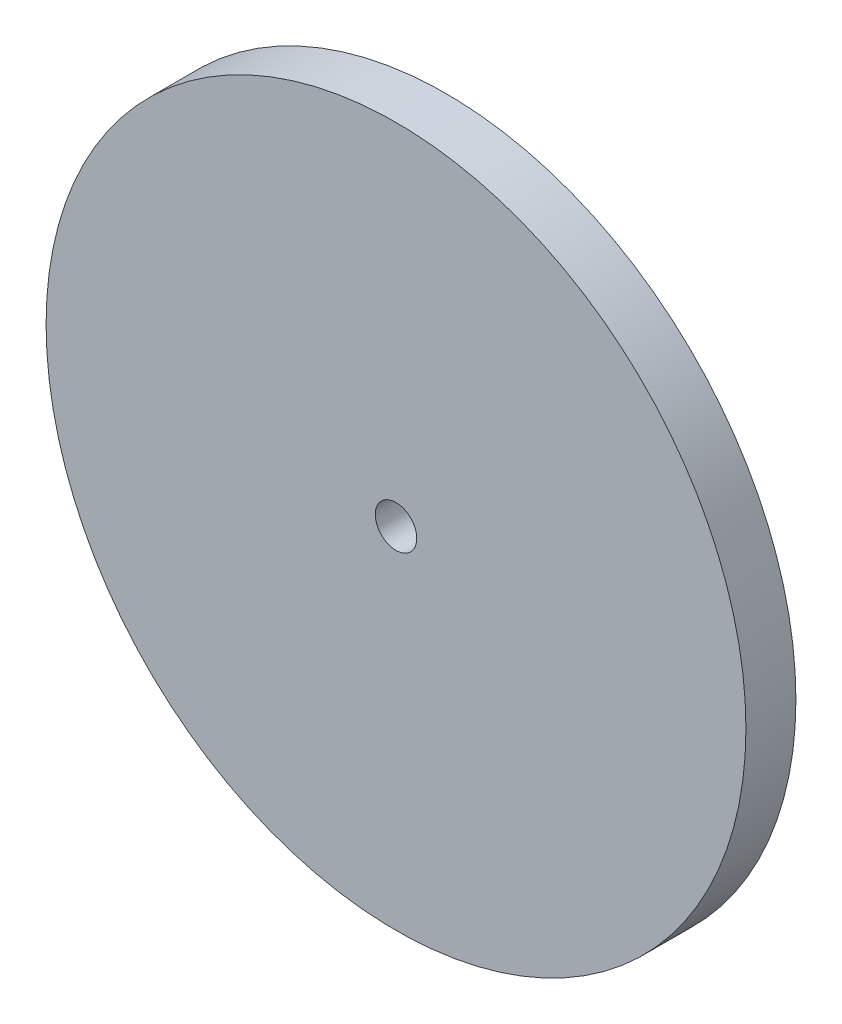
ISO-10303-21;
HEADER;
FILE_DESCRIPTION(('STEP AP214'),'2;1');
FILE_NAME('part.step','',(''),(''),'','','');
FILE_SCHEMA(('AUTOMOTIVE_DESIGN { 1 0 10303 214 1 1 1 1 }'));
ENDSEC;
DATA;
#1=APPLICATION_CONTEXT('core data for automotive mechanical design processes');
#2=APPLICATION_PROTOCOL_DEFINITION('international standard','automotive_design',2000,#1);
#3=PRODUCT_CONTEXT('',#1,'mechanical');
#4=PRODUCT('Part','Part','',(#3));
#5=PRODUCT_RELATED_PRODUCT_CATEGORY('part','',(#4));
#6=PRODUCT_DEFINITION_FORMATION('','',#4);
#7=PRODUCT_DEFINITION_CONTEXT('part definition',#1,'design');
#8=PRODUCT_DEFINITION('design','',#6,#7);
#9=PRODUCT_DEFINITION_SHAPE('','',#8);
#10=(LENGTH_UNIT() NAMED_UNIT(*) SI_UNIT(.MILLI.,.METRE.));
#11=(NAMED_UNIT(*) PLANE_ANGLE_UNIT() SI_UNIT($,.RADIAN.));
#12=(NAMED_UNIT(*) SI_UNIT($,.STERADIAN.) SOLID_ANGLE_UNIT());
#13=UNCERTAINTY_MEASURE_WITH_UNIT(LENGTH_MEASURE(1.E-05),#10,'distance_accuracy_value','');
#14=(GEOMETRIC_REPRESENTATION_CONTEXT(3) GLOBAL_UNCERTAINTY_ASSIGNED_CONTEXT((#13)) GLOBAL_UNIT_ASSIGNED_CONTEXT((#10,
#11,#12)) REPRESENTATION_CONTEXT('',''));
#15=CARTESIAN_POINT('',(0.,0.,0.));
#16=DIRECTION('',(0.,0.,1.));
#17=DIRECTION('',(1.,0.,0.));
#18=AXIS2_PLACEMENT_3D('',#15,#16,#17);
#19=CARTESIAN_POINT('',(0.,0.,5.));
#20=DIRECTION('',(0.,0.,-1.));
#21=DIRECTION('',(-1.,0.,0.));
#22=AXIS2_PLACEMENT_3D('',#19,#20,#21);
#23=CYLINDRICAL_SURFACE('',#22,35.);
#24=CARTESIAN_POINT('',(0.,0.,5.));
#25=DIRECTION('',(0.,0.,1.));
#26=DIRECTION('',(1.,0.,0.));
#27=AXIS2_PLACEMENT_3D('',#24,#25,#26);
#28=CIRCLE('',#27,35.);
#29=CARTESIAN_POINT('',(35.,0.,5.));
#30=VERTEX_POINT('',#29);
#31=EDGE_CURVE('E10',#30,#30,#28,.T.);
#32=ORIENTED_EDGE('',*,*,#31,.F.);
#33=EDGE_LOOP('',(#32));
#34=FACE_BOUND('',#33,.T.);
#35=CARTESIAN_POINT('',(0.,0.,0.));
#36=DIRECTION('',(0.,0.,1.));
#37=DIRECTION('',(1.,0.,0.));
#38=AXIS2_PLACEMENT_3D('',#35,#36,#37);
#39=CIRCLE('',#38,35.);
#40=CARTESIAN_POINT('',(35.,0.,0.));
#41=VERTEX_POINT('',#40);
#42=EDGE_CURVE('E40',#41,#41,#39,.T.);
#43=ORIENTED_EDGE('',*,*,#42,.T.);
#44=EDGE_LOOP('',(#43));
#45=FACE_BOUND('',#44,.T.);
#46=ADVANCED_FACE('F37',(#34,#45),#23,.T.);
#47=CARTESIAN_POINT('',(0.,0.,5.));
#48=DIRECTION('',(0.,0.,1.));
#49=DIRECTION('',(1.,0.,0.));
#50=AXIS2_PLACEMENT_3D('',#47,#48,#49);
#51=PLANE('',#50);
#52=CARTESIAN_POINT('',(0.,0.,5.));
#53=DIRECTION('',(0.,0.,-1.));
#54=DIRECTION('',(-1.,0.,0.));
#55=AXIS2_PLACEMENT_3D('',#52,#53,#54);
#56=CIRCLE('',#55,2.075);
#57=CARTESIAN_POINT('',(-2.075,0.,5.));
#58=VERTEX_POINT('',#57);
#59=EDGE_CURVE('E47',#58,#58,#56,.T.);
#60=ORIENTED_EDGE('',*,*,#59,.T.);
#61=EDGE_LOOP('',(#60));
#62=FACE_BOUND('',#61,.T.);
#63=ORIENTED_EDGE('',*,*,#31,.T.);
#64=EDGE_LOOP('',(#63));
#65=FACE_BOUND('',#64,.T.);
#66=ADVANCED_FACE('F55',(#62,#65),#51,.T.);
#67=CARTESIAN_POINT('',(0.,0.,0.));
#68=DIRECTION('',(0.,0.,1.));
#69=DIRECTION('',(1.,0.,0.));
#70=AXIS2_PLACEMENT_3D('',#67,#68,#69);
#71=PLANE('',#70);
#72=CARTESIAN_POINT('',(0.,0.,0.));
#73=DIRECTION('',(0.,0.,-1.));
#74=DIRECTION('',(-1.,0.,0.));
#75=AXIS2_PLACEMENT_3D('',#72,#73,#74);
#76=CIRCLE('',#75,2.075);
#77=CARTESIAN_POINT('',(-2.075,0.,0.));
#78=VERTEX_POINT('',#77);
#79=EDGE_CURVE('E49',#78,#78,#76,.T.);
#80=ORIENTED_EDGE('',*,*,#79,.F.);
#81=EDGE_LOOP('',(#80));
#82=FACE_BOUND('',#81,.T.);
#83=ORIENTED_EDGE('',*,*,#42,.F.);
#84=EDGE_LOOP('',(#83));
#85=FACE_BOUND('',#84,.T.);
#86=ADVANCED_FACE('F60',(#82,#85),#71,.F.);
#87=CARTESIAN_POINT('',(0.,0.,5.));
#88=DIRECTION('',(0.,0.,-1.));
#89=DIRECTION('',(-1.,0.,0.));
#90=AXIS2_PLACEMENT_3D('',#87,#88,#89);
#91=CYLINDRICAL_SURFACE('',#90,2.075);
#92=ORIENTED_EDGE('',*,*,#59,.F.);
#93=EDGE_LOOP('',(#92));
#94=FACE_BOUND('',#93,.T.);
#95=ORIENTED_EDGE('',*,*,#79,.T.);
#96=EDGE_LOOP('',(#95));
#97=FACE_BOUND('',#96,.T.);
#98=ADVANCED_FACE('F57',(#94,#97),#91,.F.);
#99=CLOSED_SHELL('',(#46,#66,#86,#98));
#100=MANIFOLD_SOLID_BREP('B2',#99);
#101=ADVANCED_BREP_SHAPE_REPRESENTATION('',(#18,#100),#14);
#102=SHAPE_DEFINITION_REPRESENTATION(#9,#101);
ENDSEC;
END-ISO-10303-21;
